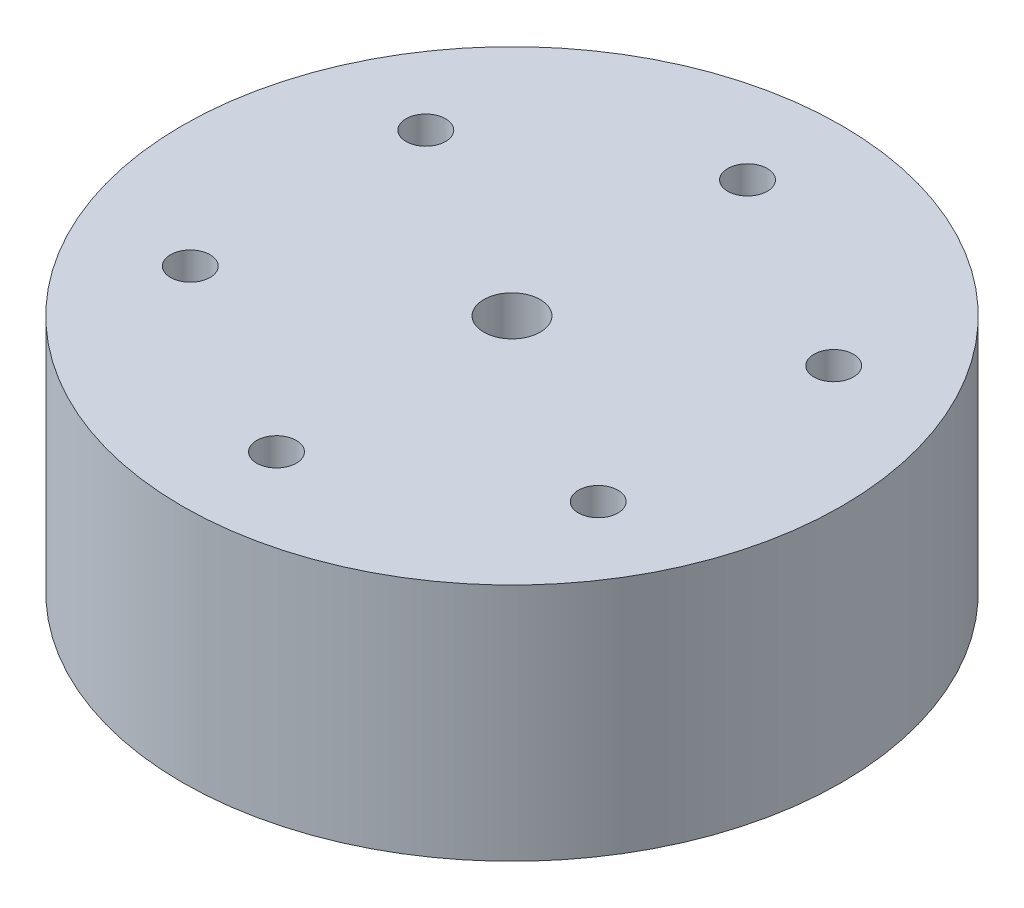
ISO-10303-21;
HEADER;
FILE_DESCRIPTION(('STEP AP214'),'2;1');
FILE_NAME('part.step','',(''),(''),'','','');
FILE_SCHEMA(('AUTOMOTIVE_DESIGN { 1 0 10303 214 1 1 1 1 }'));
ENDSEC;
DATA;
#1=APPLICATION_CONTEXT('core data for automotive mechanical design processes');
#2=APPLICATION_PROTOCOL_DEFINITION('international standard','automotive_design',2000,#1);
#3=PRODUCT_CONTEXT('',#1,'mechanical');
#4=PRODUCT('Part','Part','',(#3));
#5=PRODUCT_RELATED_PRODUCT_CATEGORY('part','',(#4));
#6=PRODUCT_DEFINITION_FORMATION('','',#4);
#7=PRODUCT_DEFINITION_CONTEXT('part definition',#1,'design');
#8=PRODUCT_DEFINITION('design','',#6,#7);
#9=PRODUCT_DEFINITION_SHAPE('','',#8);
#10=(LENGTH_UNIT() NAMED_UNIT(*) SI_UNIT(.MILLI.,.METRE.));
#11=(NAMED_UNIT(*) PLANE_ANGLE_UNIT() SI_UNIT($,.RADIAN.));
#12=(NAMED_UNIT(*) SI_UNIT($,.STERADIAN.) SOLID_ANGLE_UNIT());
#13=UNCERTAINTY_MEASURE_WITH_UNIT(LENGTH_MEASURE(1.E-05),#10,'distance_accuracy_value','');
#14=(GEOMETRIC_REPRESENTATION_CONTEXT(3) GLOBAL_UNCERTAINTY_ASSIGNED_CONTEXT((#13)) GLOBAL_UNIT_ASSIGNED_CONTEXT((#10,
#11,#12)) REPRESENTATION_CONTEXT('',''));
#15=CARTESIAN_POINT('',(0.,0.,0.));
#16=DIRECTION('',(0.,0.,1.));
#17=DIRECTION('',(1.,0.,0.));
#18=AXIS2_PLACEMENT_3D('',#15,#16,#17);
#19=CARTESIAN_POINT('',(0.,25.4,0.));
#20=DIRECTION('',(0.,-1.,0.));
#21=DIRECTION('',(0.,0.,-1.));
#22=AXIS2_PLACEMENT_3D('',#19,#20,#21);
#23=CYLINDRICAL_SURFACE('',#22,35.);
#24=CARTESIAN_POINT('',(0.,25.4,0.));
#25=DIRECTION('',(0.,1.,0.));
#26=DIRECTION('',(0.,0.,1.));
#27=AXIS2_PLACEMENT_3D('',#24,#25,#26);
#28=CIRCLE('',#27,35.);
#29=CARTESIAN_POINT('',(0.,25.4,35.));
#30=VERTEX_POINT('',#29);
#31=EDGE_CURVE('E10',#30,#30,#28,.T.);
#32=ORIENTED_EDGE('',*,*,#31,.F.);
#33=EDGE_LOOP('',(#32));
#34=FACE_BOUND('',#33,.T.);
#35=CARTESIAN_POINT('',(0.,0.,0.));
#36=DIRECTION('',(0.,1.,0.));
#37=DIRECTION('',(0.,0.,1.));
#38=AXIS2_PLACEMENT_3D('',#35,#36,#37);
#39=CIRCLE('',#38,35.);
#40=CARTESIAN_POINT('',(0.,0.,35.));
#41=VERTEX_POINT('',#40);
#42=EDGE_CURVE('E42',#41,#41,#39,.T.);
#43=ORIENTED_EDGE('',*,*,#42,.T.);
#44=EDGE_LOOP('',(#43));
#45=FACE_BOUND('',#44,.T.);
#46=ADVANCED_FACE('F39',(#34,#45),#23,.T.);
#47=CARTESIAN_POINT('',(0.,25.4,0.));
#48=DIRECTION('',(0.,1.,0.));
#49=DIRECTION('',(0.,0.,1.));
#50=AXIS2_PLACEMENT_3D('',#47,#48,#49);
#51=PLANE('',#50);
#52=CARTESIAN_POINT('',(0.,25.4,-25.));
#53=DIRECTION('',(0.,1.,0.));
#54=DIRECTION('',(0.,0.,1.));
#55=AXIS2_PLACEMENT_3D('',#52,#53,#54);
#56=CIRCLE('',#55,2.1);
#57=CARTESIAN_POINT('',(0.,25.4,-22.9));
#58=VERTEX_POINT('',#57);
#59=EDGE_CURVE('E82',#58,#58,#56,.T.);
#60=ORIENTED_EDGE('',*,*,#59,.F.);
#61=EDGE_LOOP('',(#60));
#62=FACE_BOUND('',#61,.T.);
#63=CARTESIAN_POINT('',(-21.6506350946112,25.4,-12.4999999999995));
#64=DIRECTION('',(0.,1.,0.));
#65=DIRECTION('',(0.,0.,1.));
#66=AXIS2_PLACEMENT_3D('',#63,#64,#65);
#67=CIRCLE('',#66,2.1);
#68=CARTESIAN_POINT('',(-21.6506350946112,25.4,-10.3999999999995));
#69=VERTEX_POINT('',#68);
#70=EDGE_CURVE('E61',#69,#69,#67,.T.);
#71=ORIENTED_EDGE('',*,*,#70,.F.);
#72=EDGE_LOOP('',(#71));
#73=FACE_BOUND('',#72,.T.);
#74=CARTESIAN_POINT('',(-21.650635094611,25.4,12.5));
#75=DIRECTION('',(0.,1.,0.));
#76=DIRECTION('',(0.,0.,1.));
#77=AXIS2_PLACEMENT_3D('',#74,#75,#76);
#78=CIRCLE('',#77,2.1);
#79=CARTESIAN_POINT('',(-21.650635094611,25.4,14.6));
#80=VERTEX_POINT('',#79);
#81=EDGE_CURVE('E60',#80,#80,#78,.T.);
#82=ORIENTED_EDGE('',*,*,#81,.F.);
#83=EDGE_LOOP('',(#82));
#84=FACE_BOUND('',#83,.T.);
#85=CARTESIAN_POINT('',(0.,25.4,25.));
#86=DIRECTION('',(0.,1.,0.));
#87=DIRECTION('',(0.,0.,1.));
#88=AXIS2_PLACEMENT_3D('',#85,#86,#87);
#89=CIRCLE('',#88,2.1);
#90=CARTESIAN_POINT('',(0.,25.4,27.1));
#91=VERTEX_POINT('',#90);
#92=EDGE_CURVE('E67',#91,#91,#89,.T.);
#93=ORIENTED_EDGE('',*,*,#92,.F.);
#94=EDGE_LOOP('',(#93));
#95=FACE_BOUND('',#94,.T.);
#96=CARTESIAN_POINT('',(21.650635094611,25.4,12.5));
#97=DIRECTION('',(0.,1.,0.));
#98=DIRECTION('',(0.,0.,1.));
#99=AXIS2_PLACEMENT_3D('',#96,#97,#98);
#100=CIRCLE('',#99,2.1);
#101=CARTESIAN_POINT('',(21.650635094611,25.4,14.6));
#102=VERTEX_POINT('',#101);
#103=EDGE_CURVE('E73',#102,#102,#100,.T.);
#104=ORIENTED_EDGE('',*,*,#103,.F.);
#105=EDGE_LOOP('',(#104));
#106=FACE_BOUND('',#105,.T.);
#107=CARTESIAN_POINT('',(21.6506350946115,25.4,-12.5));
#108=DIRECTION('',(0.,1.,0.));
#109=DIRECTION('',(0.,0.,1.));
#110=AXIS2_PLACEMENT_3D('',#107,#108,#109);
#111=CIRCLE('',#110,2.1);
#112=CARTESIAN_POINT('',(21.6506350946115,25.4,-10.4));
#113=VERTEX_POINT('',#112);
#114=EDGE_CURVE('E79',#113,#113,#111,.T.);
#115=ORIENTED_EDGE('',*,*,#114,.F.);
#116=EDGE_LOOP('',(#115));
#117=FACE_BOUND('',#116,.T.);
#118=CARTESIAN_POINT('',(0.,25.4,0.));
#119=DIRECTION('',(0.,1.,0.));
#120=DIRECTION('',(0.,0.,1.));
#121=AXIS2_PLACEMENT_3D('',#118,#119,#120);
#122=CIRCLE('',#121,3.);
#123=CARTESIAN_POINT('',(0.,25.4,3.));
#124=VERTEX_POINT('',#123);
#125=EDGE_CURVE('E51',#124,#124,#122,.T.);
#126=ORIENTED_EDGE('',*,*,#125,.F.);
#127=EDGE_LOOP('',(#126));
#128=FACE_BOUND('',#127,.T.);
#129=ORIENTED_EDGE('',*,*,#31,.T.);
#130=EDGE_LOOP('',(#129));
#131=FACE_BOUND('',#130,.T.);
#132=ADVANCED_FACE('F103',(#62,#73,#84,#95,#106,#117,#128,#131),#51,.T.);
#133=CARTESIAN_POINT('',(0.,0.,0.));
#134=DIRECTION('',(0.,1.,0.));
#135=DIRECTION('',(0.,0.,1.));
#136=AXIS2_PLACEMENT_3D('',#133,#134,#135);
#137=PLANE('',#136);
#138=CARTESIAN_POINT('',(0.,0.,-25.));
#139=DIRECTION('',(0.,1.,0.));
#140=DIRECTION('',(0.,0.,1.));
#141=AXIS2_PLACEMENT_3D('',#138,#139,#140);
#142=CIRCLE('',#141,2.1);
#143=CARTESIAN_POINT('',(0.,0.,-22.9));
#144=VERTEX_POINT('',#143);
#145=EDGE_CURVE('E54',#144,#144,#142,.T.);
#146=ORIENTED_EDGE('',*,*,#145,.T.);
#147=EDGE_LOOP('',(#146));
#148=FACE_BOUND('',#147,.T.);
#149=CARTESIAN_POINT('',(-21.6506350946112,0.,-12.4999999999995));
#150=DIRECTION('',(0.,1.,0.));
#151=DIRECTION('',(0.,0.,1.));
#152=AXIS2_PLACEMENT_3D('',#149,#150,#151);
#153=CIRCLE('',#152,2.1);
#154=CARTESIAN_POINT('',(-21.6506350946112,0.,-10.3999999999995));
#155=VERTEX_POINT('',#154);
#156=EDGE_CURVE('E83',#155,#155,#153,.T.);
#157=ORIENTED_EDGE('',*,*,#156,.T.);
#158=EDGE_LOOP('',(#157));
#159=FACE_BOUND('',#158,.T.);
#160=CARTESIAN_POINT('',(-21.650635094611,0.,12.5));
#161=DIRECTION('',(0.,1.,0.));
#162=DIRECTION('',(0.,0.,1.));
#163=AXIS2_PLACEMENT_3D('',#160,#161,#162);
#164=CIRCLE('',#163,2.1);
#165=CARTESIAN_POINT('',(-21.650635094611,0.,14.6));
#166=VERTEX_POINT('',#165);
#167=EDGE_CURVE('E57',#166,#166,#164,.T.);
#168=ORIENTED_EDGE('',*,*,#167,.T.);
#169=EDGE_LOOP('',(#168));
#170=FACE_BOUND('',#169,.T.);
#171=CARTESIAN_POINT('',(0.,0.,25.));
#172=DIRECTION('',(0.,1.,0.));
#173=DIRECTION('',(0.,0.,1.));
#174=AXIS2_PLACEMENT_3D('',#171,#172,#173);
#175=CIRCLE('',#174,2.1);
#176=CARTESIAN_POINT('',(0.,0.,27.1));
#177=VERTEX_POINT('',#176);
#178=EDGE_CURVE('E64',#177,#177,#175,.T.);
#179=ORIENTED_EDGE('',*,*,#178,.T.);
#180=EDGE_LOOP('',(#179));
#181=FACE_BOUND('',#180,.T.);
#182=CARTESIAN_POINT('',(21.650635094611,0.,12.5));
#183=DIRECTION('',(0.,1.,0.));
#184=DIRECTION('',(0.,0.,1.));
#185=AXIS2_PLACEMENT_3D('',#182,#183,#184);
#186=CIRCLE('',#185,2.1);
#187=CARTESIAN_POINT('',(21.650635094611,0.,14.6));
#188=VERTEX_POINT('',#187);
#189=EDGE_CURVE('E70',#188,#188,#186,.T.);
#190=ORIENTED_EDGE('',*,*,#189,.T.);
#191=EDGE_LOOP('',(#190));
#192=FACE_BOUND('',#191,.T.);
#193=CARTESIAN_POINT('',(21.6506350946115,0.,-12.5));
#194=DIRECTION('',(0.,1.,0.));
#195=DIRECTION('',(0.,0.,1.));
#196=AXIS2_PLACEMENT_3D('',#193,#194,#195);
#197=CIRCLE('',#196,2.1);
#198=CARTESIAN_POINT('',(21.6506350946115,0.,-10.4));
#199=VERTEX_POINT('',#198);
#200=EDGE_CURVE('E76',#199,#199,#197,.T.);
#201=ORIENTED_EDGE('',*,*,#200,.T.);
#202=EDGE_LOOP('',(#201));
#203=FACE_BOUND('',#202,.T.);
#204=CARTESIAN_POINT('',(0.,0.,0.));
#205=DIRECTION('',(0.,1.,0.));
#206=DIRECTION('',(0.,0.,1.));
#207=AXIS2_PLACEMENT_3D('',#204,#205,#206);
#208=CIRCLE('',#207,3.);
#209=CARTESIAN_POINT('',(0.,0.,3.));
#210=VERTEX_POINT('',#209);
#211=EDGE_CURVE('E49',#210,#210,#208,.T.);
#212=ORIENTED_EDGE('',*,*,#211,.T.);
#213=EDGE_LOOP('',(#212));
#214=FACE_BOUND('',#213,.T.);
#215=ORIENTED_EDGE('',*,*,#42,.F.);
#216=EDGE_LOOP('',(#215));
#217=FACE_BOUND('',#216,.T.);
#218=ADVANCED_FACE('F93',(#148,#159,#170,#181,#192,#203,#214,#217),#137,.F.);
#219=CARTESIAN_POINT('',(0.,0.,0.));
#220=DIRECTION('',(0.,1.,0.));
#221=DIRECTION('',(0.,0.,1.));
#222=AXIS2_PLACEMENT_3D('',#219,#220,#221);
#223=CYLINDRICAL_SURFACE('',#222,3.);
#224=ORIENTED_EDGE('',*,*,#125,.T.);
#225=EDGE_LOOP('',(#224));
#226=FACE_BOUND('',#225,.T.);
#227=ORIENTED_EDGE('',*,*,#211,.F.);
#228=EDGE_LOOP('',(#227));
#229=FACE_BOUND('',#228,.T.);
#230=ADVANCED_FACE('F119',(#226,#229),#223,.F.);
#231=CARTESIAN_POINT('',(21.6506350946115,0.,-12.5));
#232=DIRECTION('',(0.,1.,0.));
#233=DIRECTION('',(0.,0.,1.));
#234=AXIS2_PLACEMENT_3D('',#231,#232,#233);
#235=CYLINDRICAL_SURFACE('',#234,2.1);
#236=ORIENTED_EDGE('',*,*,#200,.F.);
#237=EDGE_LOOP('',(#236));
#238=FACE_BOUND('',#237,.T.);
#239=ORIENTED_EDGE('',*,*,#114,.T.);
#240=EDGE_LOOP('',(#239));
#241=FACE_BOUND('',#240,.T.);
#242=ADVANCED_FACE('F122',(#238,#241),#235,.F.);
#243=CARTESIAN_POINT('',(21.650635094611,0.,12.5));
#244=DIRECTION('',(0.,1.,0.));
#245=DIRECTION('',(0.,0.,1.));
#246=AXIS2_PLACEMENT_3D('',#243,#244,#245);
#247=CYLINDRICAL_SURFACE('',#246,2.1);
#248=ORIENTED_EDGE('',*,*,#189,.F.);
#249=EDGE_LOOP('',(#248));
#250=FACE_BOUND('',#249,.T.);
#251=ORIENTED_EDGE('',*,*,#103,.T.);
#252=EDGE_LOOP('',(#251));
#253=FACE_BOUND('',#252,.T.);
#254=ADVANCED_FACE('F152',(#250,#253),#247,.F.);
#255=CARTESIAN_POINT('',(0.,0.,25.));
#256=DIRECTION('',(0.,1.,0.));
#257=DIRECTION('',(0.,0.,1.));
#258=AXIS2_PLACEMENT_3D('',#255,#256,#257);
#259=CYLINDRICAL_SURFACE('',#258,2.1);
#260=ORIENTED_EDGE('',*,*,#178,.F.);
#261=EDGE_LOOP('',(#260));
#262=FACE_BOUND('',#261,.T.);
#263=ORIENTED_EDGE('',*,*,#92,.T.);
#264=EDGE_LOOP('',(#263));
#265=FACE_BOUND('',#264,.T.);
#266=ADVANCED_FACE('F160',(#262,#265),#259,.F.);
#267=CARTESIAN_POINT('',(-21.650635094611,0.,12.5));
#268=DIRECTION('',(0.,1.,0.));
#269=DIRECTION('',(0.,0.,1.));
#270=AXIS2_PLACEMENT_3D('',#267,#268,#269);
#271=CYLINDRICAL_SURFACE('',#270,2.1);
#272=ORIENTED_EDGE('',*,*,#167,.F.);
#273=EDGE_LOOP('',(#272));
#274=FACE_BOUND('',#273,.T.);
#275=ORIENTED_EDGE('',*,*,#81,.T.);
#276=EDGE_LOOP('',(#275));
#277=FACE_BOUND('',#276,.T.);
#278=ADVANCED_FACE('F168',(#274,#277),#271,.F.);
#279=CARTESIAN_POINT('',(-21.6506350946112,0.,-12.4999999999995));
#280=DIRECTION('',(0.,1.,0.));
#281=DIRECTION('',(0.,0.,1.));
#282=AXIS2_PLACEMENT_3D('',#279,#280,#281);
#283=CYLINDRICAL_SURFACE('',#282,2.1);
#284=ORIENTED_EDGE('',*,*,#156,.F.);
#285=EDGE_LOOP('',(#284));
#286=FACE_BOUND('',#285,.T.);
#287=ORIENTED_EDGE('',*,*,#70,.T.);
#288=EDGE_LOOP('',(#287));
#289=FACE_BOUND('',#288,.T.);
#290=ADVANCED_FACE('F99',(#286,#289),#283,.F.);
#291=CARTESIAN_POINT('',(0.,0.,-25.));
#292=DIRECTION('',(0.,1.,0.));
#293=DIRECTION('',(0.,0.,1.));
#294=AXIS2_PLACEMENT_3D('',#291,#292,#293);
#295=CYLINDRICAL_SURFACE('',#294,2.1);
#296=ORIENTED_EDGE('',*,*,#145,.F.);
#297=EDGE_LOOP('',(#296));
#298=FACE_BOUND('',#297,.T.);
#299=ORIENTED_EDGE('',*,*,#59,.T.);
#300=EDGE_LOOP('',(#299));
#301=FACE_BOUND('',#300,.T.);
#302=ADVANCED_FACE('F96',(#298,#301),#295,.F.);
#303=CLOSED_SHELL('',(#46,#132,#218,#230,#242,#254,#266,#278,#290,#302));
#304=MANIFOLD_SOLID_BREP('B2',#303);
#305=ADVANCED_BREP_SHAPE_REPRESENTATION('',(#18,#304),#14);
#306=SHAPE_DEFINITION_REPRESENTATION(#9,#305);
ENDSEC;
END-ISO-10303-21;
